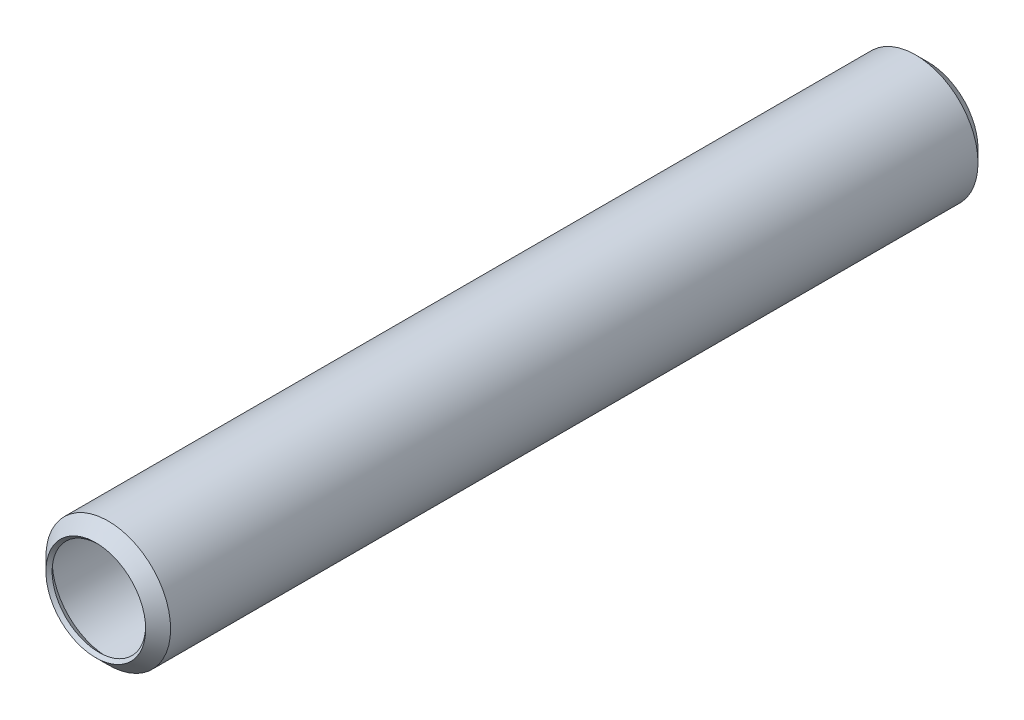
ISO-10303-21;
HEADER;
FILE_DESCRIPTION(('STEP AP214'),'2;1');
FILE_NAME('part.step','',(''),(''),'','','');
FILE_SCHEMA(('AUTOMOTIVE_DESIGN { 1 0 10303 214 1 1 1 1 }'));
ENDSEC;
DATA;
#1=APPLICATION_CONTEXT('core data for automotive mechanical design processes');
#2=APPLICATION_PROTOCOL_DEFINITION('international standard','automotive_design',2000,#1);
#3=PRODUCT_CONTEXT('',#1,'mechanical');
#4=PRODUCT('Part','Part','',(#3));
#5=PRODUCT_RELATED_PRODUCT_CATEGORY('part','',(#4));
#6=PRODUCT_DEFINITION_FORMATION('','',#4);
#7=PRODUCT_DEFINITION_CONTEXT('part definition',#1,'design');
#8=PRODUCT_DEFINITION('design','',#6,#7);
#9=PRODUCT_DEFINITION_SHAPE('','',#8);
#10=(LENGTH_UNIT() NAMED_UNIT(*) SI_UNIT(.MILLI.,.METRE.));
#11=(NAMED_UNIT(*) PLANE_ANGLE_UNIT() SI_UNIT($,.RADIAN.));
#12=(NAMED_UNIT(*) SI_UNIT($,.STERADIAN.) SOLID_ANGLE_UNIT());
#13=UNCERTAINTY_MEASURE_WITH_UNIT(LENGTH_MEASURE(1.E-05),#10,'distance_accuracy_value','');
#14=(GEOMETRIC_REPRESENTATION_CONTEXT(3) GLOBAL_UNCERTAINTY_ASSIGNED_CONTEXT((#13)) GLOBAL_UNIT_ASSIGNED_CONTEXT((#10,
#11,#12)) REPRESENTATION_CONTEXT('',''));
#15=CARTESIAN_POINT('',(0.,0.,0.));
#16=DIRECTION('',(0.,0.,1.));
#17=DIRECTION('',(1.,0.,0.));
#18=AXIS2_PLACEMENT_3D('',#15,#16,#17);
#19=CARTESIAN_POINT('',(0.,0.,-66.75));
#20=DIRECTION('',(0.,0.,1.));
#21=DIRECTION('',(1.,0.,0.));
#22=AXIS2_PLACEMENT_3D('',#19,#20,#21);
#23=CONICAL_SURFACE('',#22,8.00000000000002,0.785398163397444);
#24=CARTESIAN_POINT('',(0.,0.,-64.75));
#25=DIRECTION('',(0.,0.,1.));
#26=DIRECTION('',(1.,0.,0.));
#27=AXIS2_PLACEMENT_3D('',#24,#25,#26);
#28=CIRCLE('',#27,10.);
#29=CARTESIAN_POINT('',(10.,0.,-64.75));
#30=VERTEX_POINT('',#29);
#31=EDGE_CURVE('E60',#30,#30,#28,.T.);
#32=ORIENTED_EDGE('',*,*,#31,.F.);
#33=EDGE_LOOP('',(#32));
#34=FACE_BOUND('',#33,.T.);
#35=CARTESIAN_POINT('',(0.,0.,-66.75));
#36=DIRECTION('',(0.,0.,1.));
#37=DIRECTION('',(1.,0.,0.));
#38=AXIS2_PLACEMENT_3D('',#35,#36,#37);
#39=CIRCLE('',#38,8.00000000000002);
#40=CARTESIAN_POINT('',(8.00000000000002,0.,-66.75));
#41=VERTEX_POINT('',#40);
#42=EDGE_CURVE('E10',#41,#41,#39,.T.);
#43=ORIENTED_EDGE('',*,*,#42,.T.);
#44=EDGE_LOOP('',(#43));
#45=FACE_BOUND('',#44,.T.);
#46=ADVANCED_FACE('F32',(#34,#45),#23,.T.);
#47=CARTESIAN_POINT('',(0.,0.,-66.25));
#48=DIRECTION('',(0.,0.,-1.));
#49=DIRECTION('',(-1.,0.,0.));
#50=AXIS2_PLACEMENT_3D('',#47,#48,#49);
#51=CONICAL_SURFACE('',#50,7.50000000000004,0.785398163397455);
#52=ORIENTED_EDGE('',*,*,#42,.F.);
#53=EDGE_LOOP('',(#52));
#54=FACE_BOUND('',#53,.T.);
#55=CARTESIAN_POINT('',(0.,0.,-66.25));
#56=DIRECTION('',(0.,0.,1.));
#57=DIRECTION('',(1.,0.,0.));
#58=AXIS2_PLACEMENT_3D('',#55,#56,#57);
#59=CIRCLE('',#58,7.50000000000004);
#60=CARTESIAN_POINT('',(7.50000000000004,0.,-66.25));
#61=VERTEX_POINT('',#60);
#62=EDGE_CURVE('E38',#61,#61,#59,.T.);
#63=ORIENTED_EDGE('',*,*,#62,.T.);
#64=EDGE_LOOP('',(#63));
#65=FACE_BOUND('',#64,.T.);
#66=ADVANCED_FACE('F67',(#54,#65),#51,.F.);
#67=CARTESIAN_POINT('',(0.,0.,-64.75));
#68=DIRECTION('',(0.,0.,1.));
#69=DIRECTION('',(1.,0.,0.));
#70=AXIS2_PLACEMENT_3D('',#67,#68,#69);
#71=CONICAL_SURFACE('',#70,8.99999999999999,0.785398163397424);
#72=ORIENTED_EDGE('',*,*,#62,.F.);
#73=EDGE_LOOP('',(#72));
#74=FACE_BOUND('',#73,.T.);
#75=CARTESIAN_POINT('',(0.,0.,-64.75));
#76=DIRECTION('',(0.,0.,1.));
#77=DIRECTION('',(1.,0.,0.));
#78=AXIS2_PLACEMENT_3D('',#75,#76,#77);
#79=CIRCLE('',#78,8.99999999999999);
#80=CARTESIAN_POINT('',(8.99999999999999,0.,-64.75));
#81=VERTEX_POINT('',#80);
#82=EDGE_CURVE('E42',#81,#81,#79,.T.);
#83=ORIENTED_EDGE('',*,*,#82,.T.);
#84=EDGE_LOOP('',(#83));
#85=FACE_BOUND('',#84,.T.);
#86=ADVANCED_FACE('F71',(#74,#85),#71,.F.);
#87=CARTESIAN_POINT('',(0.,0.,0.));
#88=DIRECTION('',(0.,0.,1.));
#89=DIRECTION('',(1.,0.,0.));
#90=AXIS2_PLACEMENT_3D('',#87,#88,#89);
#91=CYLINDRICAL_SURFACE('',#90,9.);
#92=ORIENTED_EDGE('',*,*,#82,.F.);
#93=EDGE_LOOP('',(#92));
#94=FACE_BOUND('',#93,.T.);
#95=CARTESIAN_POINT('',(0.,0.,64.75));
#96=DIRECTION('',(0.,0.,1.));
#97=DIRECTION('',(1.,0.,0.));
#98=AXIS2_PLACEMENT_3D('',#95,#96,#97);
#99=CIRCLE('',#98,9.);
#100=CARTESIAN_POINT('',(9.,0.,64.75));
#101=VERTEX_POINT('',#100);
#102=EDGE_CURVE('E46',#101,#101,#99,.T.);
#103=ORIENTED_EDGE('',*,*,#102,.T.);
#104=EDGE_LOOP('',(#103));
#105=FACE_BOUND('',#104,.T.);
#106=ADVANCED_FACE('F76',(#94,#105),#91,.F.);
#107=CARTESIAN_POINT('',(0.,0.,66.25));
#108=DIRECTION('',(0.,0.,-1.));
#109=DIRECTION('',(-1.,0.,0.));
#110=AXIS2_PLACEMENT_3D('',#107,#108,#109);
#111=CONICAL_SURFACE('',#110,7.50000000000002,0.785398163397431);
#112=ORIENTED_EDGE('',*,*,#102,.F.);
#113=EDGE_LOOP('',(#112));
#114=FACE_BOUND('',#113,.T.);
#115=CARTESIAN_POINT('',(0.,0.,66.25));
#116=DIRECTION('',(0.,0.,1.));
#117=DIRECTION('',(1.,0.,0.));
#118=AXIS2_PLACEMENT_3D('',#115,#116,#117);
#119=CIRCLE('',#118,7.50000000000002);
#120=CARTESIAN_POINT('',(7.50000000000002,0.,66.25));
#121=VERTEX_POINT('',#120);
#122=EDGE_CURVE('E51',#121,#121,#119,.T.);
#123=ORIENTED_EDGE('',*,*,#122,.T.);
#124=EDGE_LOOP('',(#123));
#125=FACE_BOUND('',#124,.T.);
#126=ADVANCED_FACE('F82',(#114,#125),#111,.F.);
#127=CARTESIAN_POINT('',(0.,0.,66.75));
#128=DIRECTION('',(0.,0.,1.));
#129=DIRECTION('',(1.,0.,0.));
#130=AXIS2_PLACEMENT_3D('',#127,#128,#129);
#131=CONICAL_SURFACE('',#130,8.00000000000002,0.785398163397469);
#132=ORIENTED_EDGE('',*,*,#122,.F.);
#133=EDGE_LOOP('',(#132));
#134=FACE_BOUND('',#133,.T.);
#135=CARTESIAN_POINT('',(0.,0.,66.75));
#136=DIRECTION('',(0.,0.,1.));
#137=DIRECTION('',(1.,0.,0.));
#138=AXIS2_PLACEMENT_3D('',#135,#136,#137);
#139=CIRCLE('',#138,8.00000000000002);
#140=CARTESIAN_POINT('',(8.00000000000002,0.,66.75));
#141=VERTEX_POINT('',#140);
#142=EDGE_CURVE('E54',#141,#141,#139,.T.);
#143=ORIENTED_EDGE('',*,*,#142,.T.);
#144=EDGE_LOOP('',(#143));
#145=FACE_BOUND('',#144,.T.);
#146=ADVANCED_FACE('F86',(#134,#145),#131,.F.);
#147=CARTESIAN_POINT('',(0.,0.,64.75));
#148=DIRECTION('',(0.,0.,-1.));
#149=DIRECTION('',(-1.,0.,0.));
#150=AXIS2_PLACEMENT_3D('',#147,#148,#149);
#151=CONICAL_SURFACE('',#150,10.,0.785398163397444);
#152=ORIENTED_EDGE('',*,*,#142,.F.);
#153=EDGE_LOOP('',(#152));
#154=FACE_BOUND('',#153,.T.);
#155=CARTESIAN_POINT('',(0.,0.,64.75));
#156=DIRECTION('',(0.,0.,1.));
#157=DIRECTION('',(1.,0.,0.));
#158=AXIS2_PLACEMENT_3D('',#155,#156,#157);
#159=CIRCLE('',#158,10.);
#160=CARTESIAN_POINT('',(10.,0.,64.75));
#161=VERTEX_POINT('',#160);
#162=EDGE_CURVE('E57',#161,#161,#159,.T.);
#163=ORIENTED_EDGE('',*,*,#162,.T.);
#164=EDGE_LOOP('',(#163));
#165=FACE_BOUND('',#164,.T.);
#166=ADVANCED_FACE('F90',(#154,#165),#151,.T.);
#167=CARTESIAN_POINT('',(0.,0.,0.));
#168=DIRECTION('',(0.,0.,1.));
#169=DIRECTION('',(1.,0.,0.));
#170=AXIS2_PLACEMENT_3D('',#167,#168,#169);
#171=CYLINDRICAL_SURFACE('',#170,10.);
#172=ORIENTED_EDGE('',*,*,#162,.F.);
#173=EDGE_LOOP('',(#172));
#174=FACE_BOUND('',#173,.T.);
#175=ORIENTED_EDGE('',*,*,#31,.T.);
#176=EDGE_LOOP('',(#175));
#177=FACE_BOUND('',#176,.T.);
#178=ADVANCED_FACE('F64',(#174,#177),#171,.T.);
#179=CLOSED_SHELL('',(#46,#66,#86,#106,#126,#146,#166,#178));
#180=MANIFOLD_SOLID_BREP('B2',#179);
#181=ADVANCED_BREP_SHAPE_REPRESENTATION('',(#18,#180),#14);
#182=SHAPE_DEFINITION_REPRESENTATION(#9,#181);
ENDSEC;
END-ISO-10303-21;
